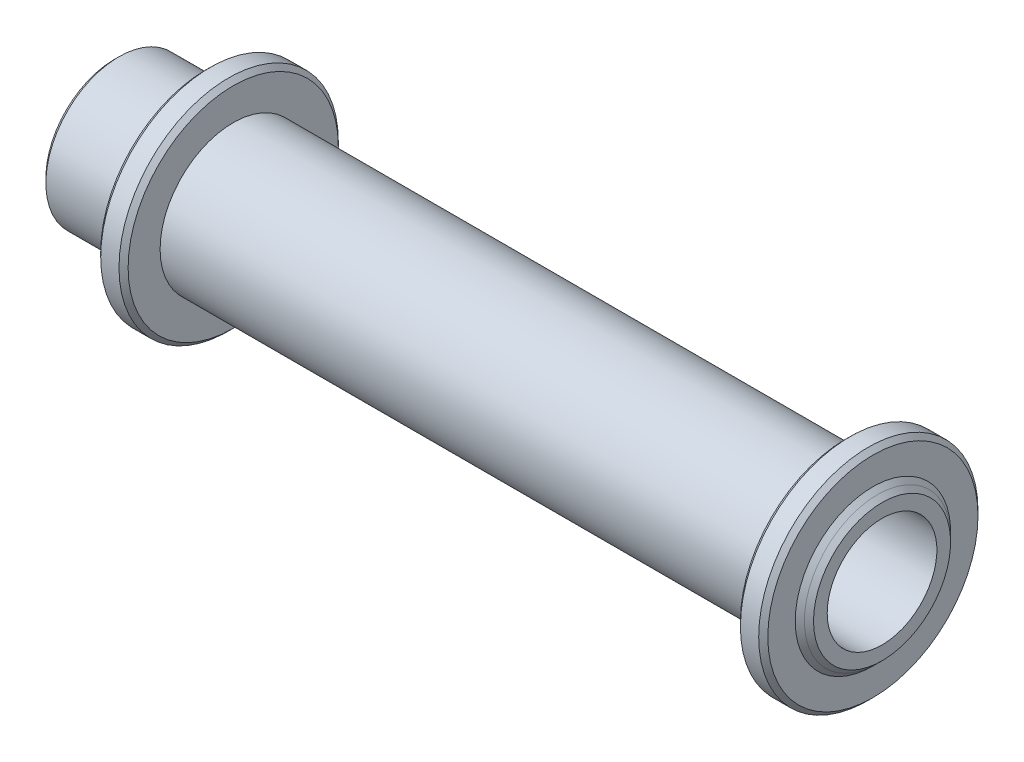
ISO-10303-21;
HEADER;
FILE_DESCRIPTION(('STEP AP214'),'2;1');
FILE_NAME('part.step','',(''),(''),'','','');
FILE_SCHEMA(('AUTOMOTIVE_DESIGN { 1 0 10303 214 1 1 1 1 }'));
ENDSEC;
DATA;
#1=APPLICATION_CONTEXT('core data for automotive mechanical design processes');
#2=APPLICATION_PROTOCOL_DEFINITION('international standard','automotive_design',2000,#1);
#3=PRODUCT_CONTEXT('',#1,'mechanical');
#4=PRODUCT('Part','Part','',(#3));
#5=PRODUCT_RELATED_PRODUCT_CATEGORY('part','',(#4));
#6=PRODUCT_DEFINITION_FORMATION('','',#4);
#7=PRODUCT_DEFINITION_CONTEXT('part definition',#1,'design');
#8=PRODUCT_DEFINITION('design','',#6,#7);
#9=PRODUCT_DEFINITION_SHAPE('','',#8);
#10=(LENGTH_UNIT() NAMED_UNIT(*) SI_UNIT(.MILLI.,.METRE.));
#11=(NAMED_UNIT(*) PLANE_ANGLE_UNIT() SI_UNIT($,.RADIAN.));
#12=(NAMED_UNIT(*) SI_UNIT($,.STERADIAN.) SOLID_ANGLE_UNIT());
#13=UNCERTAINTY_MEASURE_WITH_UNIT(LENGTH_MEASURE(1.E-05),#10,'distance_accuracy_value','');
#14=(GEOMETRIC_REPRESENTATION_CONTEXT(3) GLOBAL_UNCERTAINTY_ASSIGNED_CONTEXT((#13)) GLOBAL_UNIT_ASSIGNED_CONTEXT((#10,
#11,#12)) REPRESENTATION_CONTEXT('',''));
#15=CARTESIAN_POINT('',(0.,0.,0.));
#16=DIRECTION('',(0.,0.,1.));
#17=DIRECTION('',(1.,0.,0.));
#18=AXIS2_PLACEMENT_3D('',#15,#16,#17);
#19=CARTESIAN_POINT('',(-90.1165654282278,5.99999999999998,0.));
#20=DIRECTION('',(1.,0.,0.));
#21=DIRECTION('',(0.,0.,-1.));
#22=AXIS2_PLACEMENT_3D('',#19,#20,#21);
#23=PLANE('',#22);
#24=CARTESIAN_POINT('',(-90.1165654282278,0.,0.));
#25=DIRECTION('',(1.,0.,0.));
#26=DIRECTION('',(0.,0.,-1.));
#27=AXIS2_PLACEMENT_3D('',#24,#25,#26);
#28=CIRCLE('',#27,7.49999999999998);
#29=CARTESIAN_POINT('',(-90.1165654282278,0.,-7.49999999999998));
#30=VERTEX_POINT('',#29);
#31=EDGE_CURVE('E10',#30,#30,#28,.F.);
#32=ORIENTED_EDGE('',*,*,#31,.T.);
#33=EDGE_LOOP('',(#32));
#34=FACE_BOUND('',#33,.T.);
#35=CARTESIAN_POINT('',(-90.1165654282278,0.,0.));
#36=DIRECTION('',(-1.,0.,0.));
#37=DIRECTION('',(0.,0.,1.));
#38=AXIS2_PLACEMENT_3D('',#35,#36,#37);
#39=CIRCLE('',#38,5.99999999999998);
#40=CARTESIAN_POINT('',(-90.1165654282278,0.,5.99999999999998));
#41=VERTEX_POINT('',#40);
#42=EDGE_CURVE('E90',#41,#41,#39,.T.);
#43=ORIENTED_EDGE('',*,*,#42,.F.);
#44=EDGE_LOOP('',(#43));
#45=FACE_BOUND('',#44,.T.);
#46=ADVANCED_FACE('F31',(#34,#45),#23,.F.);
#47=CARTESIAN_POINT('',(-123.692772777803,0.,0.));
#48=DIRECTION('',(-1.,0.,0.));
#49=DIRECTION('',(0.,0.,1.));
#50=AXIS2_PLACEMENT_3D('',#47,#48,#49);
#51=CYLINDRICAL_SURFACE('',#50,8.);
#52=CARTESIAN_POINT('',(-80.6165654282278,0.,0.));
#53=DIRECTION('',(1.,0.,0.));
#54=DIRECTION('',(0.,0.,-1.));
#55=AXIS2_PLACEMENT_3D('',#52,#53,#54);
#56=CIRCLE('',#55,8.);
#57=CARTESIAN_POINT('',(-80.6165654282278,0.,-8.));
#58=VERTEX_POINT('',#57);
#59=EDGE_CURVE('E39',#58,#58,#56,.F.);
#60=ORIENTED_EDGE('',*,*,#59,.T.);
#61=EDGE_LOOP('',(#60));
#62=FACE_BOUND('',#61,.T.);
#63=CARTESIAN_POINT('',(-89.6165654282278,0.,0.));
#64=DIRECTION('',(1.,0.,0.));
#65=DIRECTION('',(0.,0.,-1.));
#66=AXIS2_PLACEMENT_3D('',#63,#64,#65);
#67=CIRCLE('',#66,8.);
#68=CARTESIAN_POINT('',(-89.6165654282278,0.,-8.));
#69=VERTEX_POINT('',#68);
#70=EDGE_CURVE('E43',#69,#69,#67,.T.);
#71=ORIENTED_EDGE('',*,*,#70,.T.);
#72=EDGE_LOOP('',(#71));
#73=FACE_BOUND('',#72,.T.);
#74=ADVANCED_FACE('F117',(#62,#73),#51,.T.);
#75=CARTESIAN_POINT('',(-80.1165654282278,8.,0.));
#76=DIRECTION('',(1.,0.,0.));
#77=DIRECTION('',(0.,0.,-1.));
#78=AXIS2_PLACEMENT_3D('',#75,#76,#77);
#79=PLANE('',#78);
#80=CARTESIAN_POINT('',(-80.1165654282278,0.,0.));
#81=DIRECTION('',(1.,0.,0.));
#82=DIRECTION('',(0.,0.,-1.));
#83=AXIS2_PLACEMENT_3D('',#80,#81,#82);
#84=CIRCLE('',#83,11.5);
#85=CARTESIAN_POINT('',(-80.1165654282278,0.,-11.5));
#86=VERTEX_POINT('',#85);
#87=EDGE_CURVE('E48',#86,#86,#84,.F.);
#88=ORIENTED_EDGE('',*,*,#87,.T.);
#89=EDGE_LOOP('',(#88));
#90=FACE_BOUND('',#89,.T.);
#91=CARTESIAN_POINT('',(-80.1165654282278,0.,0.));
#92=DIRECTION('',(1.,0.,0.));
#93=DIRECTION('',(0.,0.,-1.));
#94=AXIS2_PLACEMENT_3D('',#91,#92,#93);
#95=CIRCLE('',#94,8.50000000000001);
#96=CARTESIAN_POINT('',(-80.1165654282278,0.,-8.50000000000001));
#97=VERTEX_POINT('',#96);
#98=EDGE_CURVE('E51',#97,#97,#95,.T.);
#99=ORIENTED_EDGE('',*,*,#98,.T.);
#100=EDGE_LOOP('',(#99));
#101=FACE_BOUND('',#100,.T.);
#102=ADVANCED_FACE('F122',(#90,#101),#79,.F.);
#103=CARTESIAN_POINT('',(-123.692772777803,0.,0.));
#104=DIRECTION('',(-1.,0.,0.));
#105=DIRECTION('',(0.,0.,1.));
#106=AXIS2_PLACEMENT_3D('',#103,#104,#105);
#107=CYLINDRICAL_SURFACE('',#106,12.);
#108=CARTESIAN_POINT('',(-77.6165654282278,0.,0.));
#109=DIRECTION('',(-1.,0.,0.));
#110=DIRECTION('',(0.,0.,1.));
#111=AXIS2_PLACEMENT_3D('',#108,#109,#110);
#112=CIRCLE('',#111,12.);
#113=CARTESIAN_POINT('',(-77.6165654282278,0.,12.));
#114=VERTEX_POINT('',#113);
#115=EDGE_CURVE('E57',#114,#114,#112,.T.);
#116=ORIENTED_EDGE('',*,*,#115,.T.);
#117=EDGE_LOOP('',(#116));
#118=FACE_BOUND('',#117,.T.);
#119=CARTESIAN_POINT('',(-79.6165654282278,0.,0.));
#120=DIRECTION('',(1.,0.,0.));
#121=DIRECTION('',(0.,0.,-1.));
#122=AXIS2_PLACEMENT_3D('',#119,#120,#121);
#123=CIRCLE('',#122,12.);
#124=CARTESIAN_POINT('',(-79.6165654282278,0.,-12.));
#125=VERTEX_POINT('',#124);
#126=EDGE_CURVE('E60',#125,#125,#123,.T.);
#127=ORIENTED_EDGE('',*,*,#126,.T.);
#128=EDGE_LOOP('',(#127));
#129=FACE_BOUND('',#128,.T.);
#130=ADVANCED_FACE('F129',(#118,#129),#107,.T.);
#131=CARTESIAN_POINT('',(-77.1165654282278,12.,0.));
#132=DIRECTION('',(-1.,0.,0.));
#133=DIRECTION('',(0.,0.,1.));
#134=AXIS2_PLACEMENT_3D('',#131,#132,#133);
#135=PLANE('',#134);
#136=CARTESIAN_POINT('',(-77.1165654282278,0.,0.));
#137=DIRECTION('',(-1.,0.,0.));
#138=DIRECTION('',(0.,0.,1.));
#139=AXIS2_PLACEMENT_3D('',#136,#137,#138);
#140=CIRCLE('',#139,11.5);
#141=CARTESIAN_POINT('',(-77.1165654282278,0.,11.5));
#142=VERTEX_POINT('',#141);
#143=EDGE_CURVE('E54',#142,#142,#140,.F.);
#144=ORIENTED_EDGE('',*,*,#143,.T.);
#145=EDGE_LOOP('',(#144));
#146=FACE_BOUND('',#145,.T.);
#147=CARTESIAN_POINT('',(-77.1165654282278,0.,0.));
#148=DIRECTION('',(-1.,0.,0.));
#149=DIRECTION('',(0.,0.,1.));
#150=AXIS2_PLACEMENT_3D('',#147,#148,#149);
#151=CIRCLE('',#150,8.);
#152=CARTESIAN_POINT('',(-77.1165654282278,0.,8.));
#153=VERTEX_POINT('',#152);
#154=EDGE_CURVE('E81',#153,#153,#151,.T.);
#155=ORIENTED_EDGE('',*,*,#154,.T.);
#156=EDGE_LOOP('',(#155));
#157=FACE_BOUND('',#156,.T.);
#158=ADVANCED_FACE('F133',(#146,#157),#135,.F.);
#159=CARTESIAN_POINT('',(-123.692772777803,0.,0.));
#160=DIRECTION('',(-1.,0.,0.));
#161=DIRECTION('',(0.,0.,1.));
#162=AXIS2_PLACEMENT_3D('',#159,#160,#161);
#163=CYLINDRICAL_SURFACE('',#162,8.);
#164=ORIENTED_EDGE('',*,*,#154,.F.);
#165=EDGE_LOOP('',(#164));
#166=FACE_BOUND('',#165,.T.);
#167=CARTESIAN_POINT('',(-10.1165654282278,0.,0.));
#168=DIRECTION('',(-1.,0.,0.));
#169=DIRECTION('',(0.,0.,1.));
#170=AXIS2_PLACEMENT_3D('',#167,#168,#169);
#171=CIRCLE('',#170,8.);
#172=CARTESIAN_POINT('',(-10.1165654282278,0.,8.));
#173=VERTEX_POINT('',#172);
#174=EDGE_CURVE('E84',#173,#173,#171,.T.);
#175=ORIENTED_EDGE('',*,*,#174,.T.);
#176=EDGE_LOOP('',(#175));
#177=FACE_BOUND('',#176,.T.);
#178=ADVANCED_FACE('F137',(#166,#177),#163,.T.);
#179=CARTESIAN_POINT('',(-10.1165654282278,8.,0.));
#180=DIRECTION('',(1.,0.,0.));
#181=DIRECTION('',(0.,0.,-1.));
#182=AXIS2_PLACEMENT_3D('',#179,#180,#181);
#183=PLANE('',#182);
#184=CARTESIAN_POINT('',(-10.1165654282278,0.,0.));
#185=DIRECTION('',(1.,0.,0.));
#186=DIRECTION('',(0.,0.,-1.));
#187=AXIS2_PLACEMENT_3D('',#184,#185,#186);
#188=CIRCLE('',#187,11.5);
#189=CARTESIAN_POINT('',(-10.1165654282278,0.,-11.5));
#190=VERTEX_POINT('',#189);
#191=EDGE_CURVE('E78',#190,#190,#188,.F.);
#192=ORIENTED_EDGE('',*,*,#191,.T.);
#193=EDGE_LOOP('',(#192));
#194=FACE_BOUND('',#193,.T.);
#195=ORIENTED_EDGE('',*,*,#174,.F.);
#196=EDGE_LOOP('',(#195));
#197=FACE_BOUND('',#196,.T.);
#198=ADVANCED_FACE('F141',(#194,#197),#183,.F.);
#199=CARTESIAN_POINT('',(-123.692772777803,0.,0.));
#200=DIRECTION('',(-1.,0.,0.));
#201=DIRECTION('',(0.,0.,1.));
#202=AXIS2_PLACEMENT_3D('',#199,#200,#201);
#203=CYLINDRICAL_SURFACE('',#202,12.);
#204=CARTESIAN_POINT('',(-9.61656542822777,0.,0.));
#205=DIRECTION('',(1.,0.,0.));
#206=DIRECTION('',(0.,0.,-1.));
#207=AXIS2_PLACEMENT_3D('',#204,#205,#206);
#208=CIRCLE('',#207,12.);
#209=CARTESIAN_POINT('',(-9.61656542822777,0.,-12.));
#210=VERTEX_POINT('',#209);
#211=EDGE_CURVE('E72',#210,#210,#208,.T.);
#212=ORIENTED_EDGE('',*,*,#211,.T.);
#213=EDGE_LOOP('',(#212));
#214=FACE_BOUND('',#213,.T.);
#215=CARTESIAN_POINT('',(-7.61656542822779,0.,0.));
#216=DIRECTION('',(-1.,0.,0.));
#217=DIRECTION('',(0.,0.,1.));
#218=AXIS2_PLACEMENT_3D('',#215,#216,#217);
#219=CIRCLE('',#218,12.);
#220=CARTESIAN_POINT('',(-7.61656542822779,0.,12.));
#221=VERTEX_POINT('',#220);
#222=EDGE_CURVE('E75',#221,#221,#219,.T.);
#223=ORIENTED_EDGE('',*,*,#222,.T.);
#224=EDGE_LOOP('',(#223));
#225=FACE_BOUND('',#224,.T.);
#226=ADVANCED_FACE('F145',(#214,#225),#203,.T.);
#227=CARTESIAN_POINT('',(-7.11656542822778,12.,0.));
#228=DIRECTION('',(-1.,0.,0.));
#229=DIRECTION('',(0.,0.,1.));
#230=AXIS2_PLACEMENT_3D('',#227,#228,#229);
#231=PLANE('',#230);
#232=CARTESIAN_POINT('',(-7.11656542822778,0.,0.));
#233=DIRECTION('',(-1.,0.,0.));
#234=DIRECTION('',(0.,0.,1.));
#235=AXIS2_PLACEMENT_3D('',#232,#233,#234);
#236=CIRCLE('',#235,8.50000000000001);
#237=CARTESIAN_POINT('',(-7.11656542822778,0.,8.50000000000001));
#238=VERTEX_POINT('',#237);
#239=EDGE_CURVE('E63',#238,#238,#236,.T.);
#240=ORIENTED_EDGE('',*,*,#239,.T.);
#241=EDGE_LOOP('',(#240));
#242=FACE_BOUND('',#241,.T.);
#243=CARTESIAN_POINT('',(-7.11656542822778,0.,0.));
#244=DIRECTION('',(-1.,0.,0.));
#245=DIRECTION('',(0.,0.,1.));
#246=AXIS2_PLACEMENT_3D('',#243,#244,#245);
#247=CIRCLE('',#246,11.5);
#248=CARTESIAN_POINT('',(-7.11656542822778,0.,11.5));
#249=VERTEX_POINT('',#248);
#250=EDGE_CURVE('E66',#249,#249,#247,.F.);
#251=ORIENTED_EDGE('',*,*,#250,.T.);
#252=EDGE_LOOP('',(#251));
#253=FACE_BOUND('',#252,.T.);
#254=ADVANCED_FACE('F149',(#242,#253),#231,.F.);
#255=CARTESIAN_POINT('',(-6.11656542822778,8.,0.));
#256=DIRECTION('',(-1.,0.,0.));
#257=DIRECTION('',(0.,0.,1.));
#258=AXIS2_PLACEMENT_3D('',#255,#256,#257);
#259=PLANE('',#258);
#260=CARTESIAN_POINT('',(-6.11656542822778,0.,0.));
#261=DIRECTION('',(-1.,0.,0.));
#262=DIRECTION('',(0.,0.,1.));
#263=AXIS2_PLACEMENT_3D('',#260,#261,#262);
#264=CIRCLE('',#263,7.5);
#265=CARTESIAN_POINT('',(-6.11656542822778,0.,7.5));
#266=VERTEX_POINT('',#265);
#267=EDGE_CURVE('E69',#266,#266,#264,.F.);
#268=ORIENTED_EDGE('',*,*,#267,.T.);
#269=EDGE_LOOP('',(#268));
#270=FACE_BOUND('',#269,.T.);
#271=CARTESIAN_POINT('',(-6.11656542822778,0.,0.));
#272=DIRECTION('',(-1.,0.,0.));
#273=DIRECTION('',(0.,0.,1.));
#274=AXIS2_PLACEMENT_3D('',#271,#272,#273);
#275=CIRCLE('',#274,5.99999999999999);
#276=CARTESIAN_POINT('',(-6.11656542822778,0.,5.99999999999999));
#277=VERTEX_POINT('',#276);
#278=EDGE_CURVE('E87',#277,#277,#275,.T.);
#279=ORIENTED_EDGE('',*,*,#278,.T.);
#280=EDGE_LOOP('',(#279));
#281=FACE_BOUND('',#280,.T.);
#282=ADVANCED_FACE('F153',(#270,#281),#259,.F.);
#283=CARTESIAN_POINT('',(-123.692772777803,0.,0.));
#284=DIRECTION('',(-1.,0.,0.));
#285=DIRECTION('',(0.,0.,1.));
#286=AXIS2_PLACEMENT_3D('',#283,#284,#285);
#287=CYLINDRICAL_SURFACE('',#286,5.99999999999998);
#288=ORIENTED_EDGE('',*,*,#278,.F.);
#289=EDGE_LOOP('',(#288));
#290=FACE_BOUND('',#289,.T.);
#291=ORIENTED_EDGE('',*,*,#42,.T.);
#292=EDGE_LOOP('',(#291));
#293=FACE_BOUND('',#292,.T.);
#294=ADVANCED_FACE('F111',(#290,#293),#287,.F.);
#295=CARTESIAN_POINT('',(-10.1165654282278,0.,0.));
#296=DIRECTION('',(1.,0.,0.));
#297=DIRECTION('',(0.,0.,-1.));
#298=AXIS2_PLACEMENT_3D('',#295,#296,#297);
#299=CONICAL_SURFACE('',#298,11.5,0.785398163397426);
#300=ORIENTED_EDGE('',*,*,#211,.F.);
#301=EDGE_LOOP('',(#300));
#302=FACE_BOUND('',#301,.T.);
#303=ORIENTED_EDGE('',*,*,#191,.F.);
#304=EDGE_LOOP('',(#303));
#305=FACE_BOUND('',#304,.T.);
#306=ADVANCED_FACE('F101',(#302,#305),#299,.T.);
#307=CARTESIAN_POINT('',(-7.11656542822778,0.,0.));
#308=DIRECTION('',(-1.,0.,0.));
#309=DIRECTION('',(0.,0.,1.));
#310=AXIS2_PLACEMENT_3D('',#307,#308,#309);
#311=CONICAL_SURFACE('',#310,8.50000000000001,0.785398163397443);
#312=ORIENTED_EDGE('',*,*,#239,.F.);
#313=EDGE_LOOP('',(#312));
#314=FACE_BOUND('',#313,.T.);
#315=CARTESIAN_POINT('',(-6.61656542822776,0.,0.));
#316=DIRECTION('',(-1.,0.,0.));
#317=DIRECTION('',(0.,0.,1.));
#318=AXIS2_PLACEMENT_3D('',#315,#316,#317);
#319=CIRCLE('',#318,8.);
#320=CARTESIAN_POINT('',(-6.61656542822776,0.,8.));
#321=VERTEX_POINT('',#320);
#322=EDGE_CURVE('E35',#321,#321,#319,.F.);
#323=ORIENTED_EDGE('',*,*,#322,.F.);
#324=EDGE_LOOP('',(#323));
#325=FACE_BOUND('',#324,.T.);
#326=ADVANCED_FACE('F99',(#314,#325),#311,.T.);
#327=CARTESIAN_POINT('',(-6.61656542822778,0.,0.));
#328=DIRECTION('',(-1.,0.,0.));
#329=DIRECTION('',(0.,0.,1.));
#330=AXIS2_PLACEMENT_3D('',#327,#328,#329);
#331=CONICAL_SURFACE('',#330,8.,0.785398163397447);
#332=ORIENTED_EDGE('',*,*,#267,.F.);
#333=EDGE_LOOP('',(#332));
#334=FACE_BOUND('',#333,.T.);
#335=ORIENTED_EDGE('',*,*,#322,.T.);
#336=EDGE_LOOP('',(#335));
#337=FACE_BOUND('',#336,.T.);
#338=ADVANCED_FACE('F97',(#334,#337),#331,.T.);
#339=CARTESIAN_POINT('',(-7.61656542822779,0.,0.));
#340=DIRECTION('',(-1.,0.,0.));
#341=DIRECTION('',(0.,0.,1.));
#342=AXIS2_PLACEMENT_3D('',#339,#340,#341);
#343=CONICAL_SURFACE('',#342,12.,0.785398163397452);
#344=ORIENTED_EDGE('',*,*,#250,.F.);
#345=EDGE_LOOP('',(#344));
#346=FACE_BOUND('',#345,.T.);
#347=ORIENTED_EDGE('',*,*,#222,.F.);
#348=EDGE_LOOP('',(#347));
#349=FACE_BOUND('',#348,.T.);
#350=ADVANCED_FACE('F108',(#346,#349),#343,.T.);
#351=CARTESIAN_POINT('',(-77.6165654282278,0.,0.));
#352=DIRECTION('',(-1.,0.,0.));
#353=DIRECTION('',(0.,0.,1.));
#354=AXIS2_PLACEMENT_3D('',#351,#352,#353);
#355=CONICAL_SURFACE('',#354,12.,0.78539816339746);
#356=ORIENTED_EDGE('',*,*,#143,.F.);
#357=EDGE_LOOP('',(#356));
#358=FACE_BOUND('',#357,.T.);
#359=ORIENTED_EDGE('',*,*,#115,.F.);
#360=EDGE_LOOP('',(#359));
#361=FACE_BOUND('',#360,.T.);
#362=ADVANCED_FACE('F193',(#358,#361),#355,.T.);
#363=CARTESIAN_POINT('',(-80.1165654282278,0.,0.));
#364=DIRECTION('',(1.,0.,0.));
#365=DIRECTION('',(0.,0.,-1.));
#366=AXIS2_PLACEMENT_3D('',#363,#364,#365);
#367=CONICAL_SURFACE('',#366,11.5,0.78539816339744);
#368=ORIENTED_EDGE('',*,*,#126,.F.);
#369=EDGE_LOOP('',(#368));
#370=FACE_BOUND('',#369,.T.);
#371=ORIENTED_EDGE('',*,*,#87,.F.);
#372=EDGE_LOOP('',(#371));
#373=FACE_BOUND('',#372,.T.);
#374=ADVANCED_FACE('F202',(#370,#373),#367,.T.);
#375=CARTESIAN_POINT('',(-80.6165654282278,0.,0.));
#376=DIRECTION('',(1.,0.,0.));
#377=DIRECTION('',(0.,0.,-1.));
#378=AXIS2_PLACEMENT_3D('',#375,#376,#377);
#379=CONICAL_SURFACE('',#378,8.,0.785398163397455);
#380=ORIENTED_EDGE('',*,*,#98,.F.);
#381=EDGE_LOOP('',(#380));
#382=FACE_BOUND('',#381,.T.);
#383=ORIENTED_EDGE('',*,*,#59,.F.);
#384=EDGE_LOOP('',(#383));
#385=FACE_BOUND('',#384,.T.);
#386=ADVANCED_FACE('F212',(#382,#385),#379,.T.);
#387=CARTESIAN_POINT('',(-90.1165654282278,0.,0.));
#388=DIRECTION('',(1.,0.,0.));
#389=DIRECTION('',(0.,0.,-1.));
#390=AXIS2_PLACEMENT_3D('',#387,#388,#389);
#391=CONICAL_SURFACE('',#390,7.49999999999998,0.785398163397455);
#392=ORIENTED_EDGE('',*,*,#70,.F.);
#393=EDGE_LOOP('',(#392));
#394=FACE_BOUND('',#393,.T.);
#395=ORIENTED_EDGE('',*,*,#31,.F.);
#396=EDGE_LOOP('',(#395));
#397=FACE_BOUND('',#396,.T.);
#398=ADVANCED_FACE('F33',(#394,#397),#391,.T.);
#399=CLOSED_SHELL('',(#46,#74,#102,#130,#158,#178,#198,#226,#254,#282,#294,#306,#326,#338,#350,
#362,#374,#386,#398));
#400=MANIFOLD_SOLID_BREP('B2',#399);
#401=ADVANCED_BREP_SHAPE_REPRESENTATION('',(#18,#400),#14);
#402=SHAPE_DEFINITION_REPRESENTATION(#9,#401);
ENDSEC;
END-ISO-10303-21;
